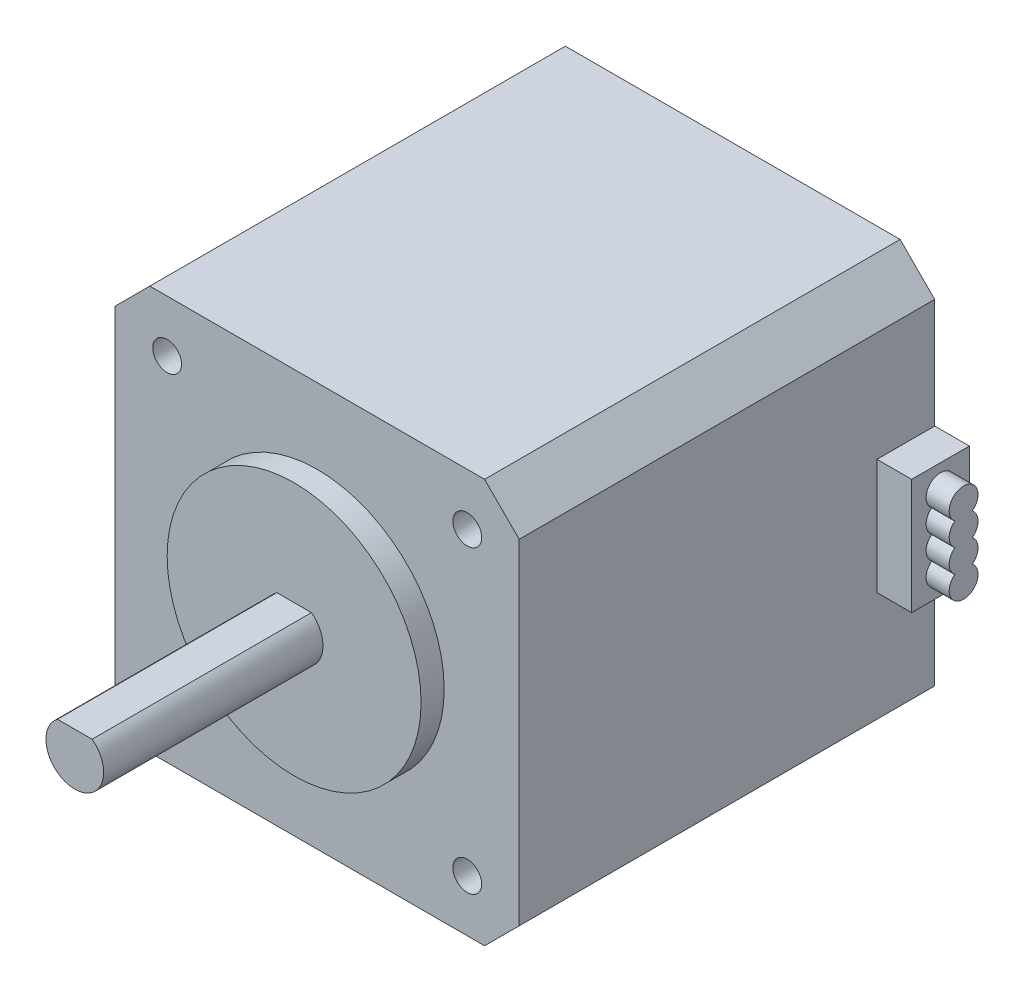
ISO-10303-21;
HEADER;
FILE_DESCRIPTION(('STEP AP214'),'2;1');
FILE_NAME('part.step','',(''),(''),'','','');
FILE_SCHEMA(('AUTOMOTIVE_DESIGN { 1 0 10303 214 1 1 1 1 }'));
ENDSEC;
DATA;
#1=APPLICATION_CONTEXT('core data for automotive mechanical design processes');
#2=APPLICATION_PROTOCOL_DEFINITION('international standard','automotive_design',2000,#1);
#3=PRODUCT_CONTEXT('',#1,'mechanical');
#4=PRODUCT('Part','Part','',(#3));
#5=PRODUCT_RELATED_PRODUCT_CATEGORY('part','',(#4));
#6=PRODUCT_DEFINITION_FORMATION('','',#4);
#7=PRODUCT_DEFINITION_CONTEXT('part definition',#1,'design');
#8=PRODUCT_DEFINITION('design','',#6,#7);
#9=PRODUCT_DEFINITION_SHAPE('','',#8);
#10=(LENGTH_UNIT() NAMED_UNIT(*) SI_UNIT(.MILLI.,.METRE.));
#11=(NAMED_UNIT(*) PLANE_ANGLE_UNIT() SI_UNIT($,.RADIAN.));
#12=(NAMED_UNIT(*) SI_UNIT($,.STERADIAN.) SOLID_ANGLE_UNIT());
#13=UNCERTAINTY_MEASURE_WITH_UNIT(LENGTH_MEASURE(1.E-05),#10,'distance_accuracy_value','');
#14=(GEOMETRIC_REPRESENTATION_CONTEXT(3) GLOBAL_UNCERTAINTY_ASSIGNED_CONTEXT((#13)) GLOBAL_UNIT_ASSIGNED_CONTEXT((#10,
#11,#12)) REPRESENTATION_CONTEXT('',''));
#15=CARTESIAN_POINT('',(0.,0.,0.));
#16=DIRECTION('',(0.,0.,1.));
#17=DIRECTION('',(1.,0.,0.));
#18=AXIS2_PLACEMENT_3D('',#15,#16,#17);
#19=CARTESIAN_POINT('',(17.5,-14.5,-36.));
#20=DIRECTION('',(1.,0.,0.));
#21=DIRECTION('',(0.,0.,-1.));
#22=AXIS2_PLACEMENT_3D('',#19,#20,#21);
#23=PLANE('',#22);
#24=DIRECTION('',(0.,1.,0.));
#25=VECTOR('',#24,1.);
#26=CARTESIAN_POINT('',(17.5,-5.,-31.));
#27=LINE('',#26,#25);
#28=CARTESIAN_POINT('',(17.5,-5.,-31.));
#29=VERTEX_POINT('',#28);
#30=CARTESIAN_POINT('',(17.5,5.,-31.));
#31=VERTEX_POINT('',#30);
#32=EDGE_CURVE('E88',#29,#31,#27,.T.);
#33=ORIENTED_EDGE('',*,*,#32,.T.);
#34=DIRECTION('',(0.,0.,-1.));
#35=VECTOR('',#34,1.);
#36=CARTESIAN_POINT('',(17.5,5.,-31.));
#37=LINE('',#36,#35);
#38=CARTESIAN_POINT('',(17.5,5.,-36.));
#39=VERTEX_POINT('',#38);
#40=EDGE_CURVE('E277',#31,#39,#37,.T.);
#41=ORIENTED_EDGE('',*,*,#40,.T.);
#42=DIRECTION('',(0.,1.,0.));
#43=VECTOR('',#42,1.);
#44=CARTESIAN_POINT('',(17.5,-14.5,-36.));
#45=LINE('',#44,#43);
#46=CARTESIAN_POINT('',(17.5,14.5,-36.));
#47=VERTEX_POINT('',#46);
#48=EDGE_CURVE('E286',#39,#47,#45,.T.);
#49=ORIENTED_EDGE('',*,*,#48,.T.);
#50=DIRECTION('',(0.,0.,1.));
#51=VECTOR('',#50,1.);
#52=CARTESIAN_POINT('',(17.5,14.5,-36.));
#53=LINE('',#52,#51);
#54=CARTESIAN_POINT('',(17.5,14.5,0.));
#55=VERTEX_POINT('',#54);
#56=EDGE_CURVE('E370',#47,#55,#53,.T.);
#57=ORIENTED_EDGE('',*,*,#56,.T.);
#58=DIRECTION('',(0.,1.,0.));
#59=VECTOR('',#58,1.);
#60=CARTESIAN_POINT('',(17.5,-14.5,0.));
#61=LINE('',#60,#59);
#62=CARTESIAN_POINT('',(17.5,-14.5,0.));
#63=VERTEX_POINT('',#62);
#64=EDGE_CURVE('E348',#63,#55,#61,.T.);
#65=ORIENTED_EDGE('',*,*,#64,.F.);
#66=DIRECTION('',(0.,0.,1.));
#67=VECTOR('',#66,1.);
#68=CARTESIAN_POINT('',(17.5,-14.5,-36.));
#69=LINE('',#68,#67);
#70=CARTESIAN_POINT('',(17.5,-14.5,-36.));
#71=VERTEX_POINT('',#70);
#72=EDGE_CURVE('E385',#71,#63,#69,.T.);
#73=ORIENTED_EDGE('',*,*,#72,.F.);
#74=CARTESIAN_POINT('',(17.5,-5.,-36.));
#75=VERTEX_POINT('',#74);
#76=EDGE_CURVE('E365',#71,#75,#45,.T.);
#77=ORIENTED_EDGE('',*,*,#76,.T.);
#78=DIRECTION('',(0.,0.,-1.));
#79=VECTOR('',#78,1.);
#80=CARTESIAN_POINT('',(17.5,-5.,-31.));
#81=LINE('',#80,#79);
#82=EDGE_CURVE('E268',#29,#75,#81,.T.);
#83=ORIENTED_EDGE('',*,*,#82,.F.);
#84=EDGE_LOOP('',(#33,#41,#49,#57,#65,#73,#77,#83));
#85=FACE_BOUND('',#84,.T.);
#86=ADVANCED_FACE('F63',(#85),#23,.T.);
#87=CARTESIAN_POINT('',(0.,0.,0.));
#88=DIRECTION('',(0.,0.,1.));
#89=DIRECTION('',(1.,0.,0.));
#90=AXIS2_PLACEMENT_3D('',#87,#88,#89);
#91=PLANE('',#90);
#92=CARTESIAN_POINT('',(13.,13.,0.));
#93=DIRECTION('',(0.,0.,1.));
#94=DIRECTION('',(1.,0.,0.));
#95=AXIS2_PLACEMENT_3D('',#92,#93,#94);
#96=CIRCLE('',#95,1.25);
#97=CARTESIAN_POINT('',(14.25,13.,0.));
#98=VERTEX_POINT('',#97);
#99=EDGE_CURVE('E313',#98,#98,#96,.T.);
#100=ORIENTED_EDGE('',*,*,#99,.F.);
#101=EDGE_LOOP('',(#100));
#102=FACE_BOUND('',#101,.T.);
#103=CARTESIAN_POINT('',(-13.,13.,0.));
#104=DIRECTION('',(0.,0.,1.));
#105=DIRECTION('',(1.,0.,0.));
#106=AXIS2_PLACEMENT_3D('',#103,#104,#105);
#107=CIRCLE('',#106,1.25);
#108=CARTESIAN_POINT('',(-11.75,13.,0.));
#109=VERTEX_POINT('',#108);
#110=EDGE_CURVE('E319',#109,#109,#107,.T.);
#111=ORIENTED_EDGE('',*,*,#110,.F.);
#112=EDGE_LOOP('',(#111));
#113=FACE_BOUND('',#112,.T.);
#114=CARTESIAN_POINT('',(-13.,-13.,0.));
#115=DIRECTION('',(0.,0.,1.));
#116=DIRECTION('',(1.,0.,0.));
#117=AXIS2_PLACEMENT_3D('',#114,#115,#116);
#118=CIRCLE('',#117,1.25);
#119=CARTESIAN_POINT('',(-11.75,-13.,0.));
#120=VERTEX_POINT('',#119);
#121=EDGE_CURVE('E325',#120,#120,#118,.T.);
#122=ORIENTED_EDGE('',*,*,#121,.F.);
#123=EDGE_LOOP('',(#122));
#124=FACE_BOUND('',#123,.T.);
#125=CARTESIAN_POINT('',(13.,-13.,0.));
#126=DIRECTION('',(0.,0.,1.));
#127=DIRECTION('',(1.,0.,0.));
#128=AXIS2_PLACEMENT_3D('',#125,#126,#127);
#129=CIRCLE('',#128,1.25);
#130=CARTESIAN_POINT('',(14.25,-13.,0.));
#131=VERTEX_POINT('',#130);
#132=EDGE_CURVE('E331',#131,#131,#129,.T.);
#133=ORIENTED_EDGE('',*,*,#132,.F.);
#134=EDGE_LOOP('',(#133));
#135=FACE_BOUND('',#134,.T.);
#136=DIRECTION('',(-0.707106781186548,0.707106781186547,0.));
#137=VECTOR('',#136,1.);
#138=CARTESIAN_POINT('',(17.5,14.5,0.));
#139=LINE('',#138,#137);
#140=CARTESIAN_POINT('',(14.5,17.5,0.));
#141=VERTEX_POINT('',#140);
#142=EDGE_CURVE('E341',#55,#141,#139,.T.);
#143=ORIENTED_EDGE('',*,*,#142,.T.);
#144=DIRECTION('',(-1.,0.,0.));
#145=VECTOR('',#144,1.);
#146=CARTESIAN_POINT('',(14.5,17.5,0.));
#147=LINE('',#146,#145);
#148=CARTESIAN_POINT('',(-14.5,17.5,0.));
#149=VERTEX_POINT('',#148);
#150=EDGE_CURVE('E401',#141,#149,#147,.T.);
#151=ORIENTED_EDGE('',*,*,#150,.T.);
#152=DIRECTION('',(-0.707106781186547,-0.707106781186548,0.));
#153=VECTOR('',#152,1.);
#154=CARTESIAN_POINT('',(-14.5,17.5,0.));
#155=LINE('',#154,#153);
#156=CARTESIAN_POINT('',(-17.5,14.5,0.));
#157=VERTEX_POINT('',#156);
#158=EDGE_CURVE('E399',#149,#157,#155,.T.);
#159=ORIENTED_EDGE('',*,*,#158,.T.);
#160=DIRECTION('',(0.,1.,0.));
#161=VECTOR('',#160,1.);
#162=CARTESIAN_POINT('',(-17.5,-14.5,0.));
#163=LINE('',#162,#161);
#164=CARTESIAN_POINT('',(-17.5,-14.5,0.));
#165=VERTEX_POINT('',#164);
#166=EDGE_CURVE('E396',#165,#157,#163,.T.);
#167=ORIENTED_EDGE('',*,*,#166,.F.);
#168=DIRECTION('',(-0.707106781186548,0.707106781186547,0.));
#169=VECTOR('',#168,1.);
#170=CARTESIAN_POINT('',(-14.5,-17.5,0.));
#171=LINE('',#170,#169);
#172=CARTESIAN_POINT('',(-14.5,-17.5,0.));
#173=VERTEX_POINT('',#172);
#174=EDGE_CURVE('E394',#173,#165,#171,.T.);
#175=ORIENTED_EDGE('',*,*,#174,.F.);
#176=DIRECTION('',(-1.,0.,0.));
#177=VECTOR('',#176,1.);
#178=CARTESIAN_POINT('',(14.5,-17.5,0.));
#179=LINE('',#178,#177);
#180=CARTESIAN_POINT('',(14.5,-17.5,0.));
#181=VERTEX_POINT('',#180);
#182=EDGE_CURVE('E392',#181,#173,#179,.T.);
#183=ORIENTED_EDGE('',*,*,#182,.F.);
#184=DIRECTION('',(-0.707106781186548,-0.707106781186547,0.));
#185=VECTOR('',#184,1.);
#186=CARTESIAN_POINT('',(17.5,-14.5,0.));
#187=LINE('',#186,#185);
#188=EDGE_CURVE('E390',#63,#181,#187,.T.);
#189=ORIENTED_EDGE('',*,*,#188,.F.);
#190=ORIENTED_EDGE('',*,*,#64,.T.);
#191=EDGE_LOOP('',(#143,#151,#159,#167,#175,#183,#189,#190));
#192=FACE_BOUND('',#191,.T.);
#193=CARTESIAN_POINT('',(0.,0.,0.));
#194=DIRECTION('',(0.,0.,1.));
#195=DIRECTION('',(1.,0.,0.));
#196=AXIS2_PLACEMENT_3D('',#193,#194,#195);
#197=CIRCLE('',#196,11.);
#198=CARTESIAN_POINT('',(11.,0.,0.));
#199=VERTEX_POINT('',#198);
#200=EDGE_CURVE('E337',#199,#199,#197,.T.);
#201=ORIENTED_EDGE('',*,*,#200,.F.);
#202=EDGE_LOOP('',(#201));
#203=FACE_BOUND('',#202,.T.);
#204=ADVANCED_FACE('F407',(#102,#113,#124,#135,#192,#203),#91,.T.);
#205=CARTESIAN_POINT('',(17.5,14.5,-36.));
#206=DIRECTION('',(0.707106781186547,0.707106781186548,0.));
#207=DIRECTION('',(-0.707106781186548,0.707106781186547,0.));
#208=AXIS2_PLACEMENT_3D('',#205,#206,#207);
#209=PLANE('',#208);
#210=ORIENTED_EDGE('',*,*,#142,.F.);
#211=ORIENTED_EDGE('',*,*,#56,.F.);
#212=DIRECTION('',(-0.707106781186548,0.707106781186547,0.));
#213=VECTOR('',#212,1.);
#214=CARTESIAN_POINT('',(17.5,14.5,-36.));
#215=LINE('',#214,#213);
#216=CARTESIAN_POINT('',(14.5,17.5,-36.));
#217=VERTEX_POINT('',#216);
#218=EDGE_CURVE('E344',#47,#217,#215,.T.);
#219=ORIENTED_EDGE('',*,*,#218,.T.);
#220=DIRECTION('',(0.,0.,1.));
#221=VECTOR('',#220,1.);
#222=CARTESIAN_POINT('',(14.5,17.5,-36.));
#223=LINE('',#222,#221);
#224=EDGE_CURVE('E366',#217,#141,#223,.T.);
#225=ORIENTED_EDGE('',*,*,#224,.T.);
#226=EDGE_LOOP('',(#210,#211,#219,#225));
#227=FACE_BOUND('',#226,.T.);
#228=ADVANCED_FACE('F65',(#227),#209,.T.);
#229=CARTESIAN_POINT('',(17.5,-14.5,-36.));
#230=DIRECTION('',(-0.707106781186547,0.707106781186548,0.));
#231=DIRECTION('',(-0.707106781186548,-0.707106781186547,0.));
#232=AXIS2_PLACEMENT_3D('',#229,#230,#231);
#233=PLANE('',#232);
#234=ORIENTED_EDGE('',*,*,#188,.T.);
#235=DIRECTION('',(0.,0.,1.));
#236=VECTOR('',#235,1.);
#237=CARTESIAN_POINT('',(14.5,-17.5,-36.));
#238=LINE('',#237,#236);
#239=CARTESIAN_POINT('',(14.5,-17.5,-36.));
#240=VERTEX_POINT('',#239);
#241=EDGE_CURVE('E382',#240,#181,#238,.T.);
#242=ORIENTED_EDGE('',*,*,#241,.F.);
#243=DIRECTION('',(-0.707106781186548,-0.707106781186547,0.));
#244=VECTOR('',#243,1.);
#245=CARTESIAN_POINT('',(17.5,-14.5,-36.));
#246=LINE('',#245,#244);
#247=EDGE_CURVE('E360',#71,#240,#246,.T.);
#248=ORIENTED_EDGE('',*,*,#247,.F.);
#249=ORIENTED_EDGE('',*,*,#72,.T.);
#250=EDGE_LOOP('',(#234,#242,#248,#249));
#251=FACE_BOUND('',#250,.T.);
#252=ADVANCED_FACE('F444',(#251),#233,.F.);
#253=CARTESIAN_POINT('',(14.5,-17.5,-36.));
#254=DIRECTION('',(0.,1.,0.));
#255=DIRECTION('',(-1.,0.,0.));
#256=AXIS2_PLACEMENT_3D('',#253,#254,#255);
#257=PLANE('',#256);
#258=ORIENTED_EDGE('',*,*,#182,.T.);
#259=DIRECTION('',(0.,0.,1.));
#260=VECTOR('',#259,1.);
#261=CARTESIAN_POINT('',(-14.5,-17.5,-36.));
#262=LINE('',#261,#260);
#263=CARTESIAN_POINT('',(-14.5,-17.5,-36.));
#264=VERTEX_POINT('',#263);
#265=EDGE_CURVE('E379',#264,#173,#262,.T.);
#266=ORIENTED_EDGE('',*,*,#265,.F.);
#267=DIRECTION('',(-1.,0.,0.));
#268=VECTOR('',#267,1.);
#269=CARTESIAN_POINT('',(14.5,-17.5,-36.));
#270=LINE('',#269,#268);
#271=EDGE_CURVE('E358',#240,#264,#270,.T.);
#272=ORIENTED_EDGE('',*,*,#271,.F.);
#273=ORIENTED_EDGE('',*,*,#241,.T.);
#274=EDGE_LOOP('',(#258,#266,#272,#273));
#275=FACE_BOUND('',#274,.T.);
#276=ADVANCED_FACE('F435',(#275),#257,.F.);
#277=CARTESIAN_POINT('',(-14.5,-17.5,-36.));
#278=DIRECTION('',(0.707106781186547,0.707106781186548,0.));
#279=DIRECTION('',(-0.707106781186548,0.707106781186547,0.));
#280=AXIS2_PLACEMENT_3D('',#277,#278,#279);
#281=PLANE('',#280);
#282=ORIENTED_EDGE('',*,*,#174,.T.);
#283=DIRECTION('',(0.,0.,1.));
#284=VECTOR('',#283,1.);
#285=CARTESIAN_POINT('',(-17.5,-14.5,-36.));
#286=LINE('',#285,#284);
#287=CARTESIAN_POINT('',(-17.5,-14.5,-36.));
#288=VERTEX_POINT('',#287);
#289=EDGE_CURVE('E376',#288,#165,#286,.T.);
#290=ORIENTED_EDGE('',*,*,#289,.F.);
#291=DIRECTION('',(-0.707106781186548,0.707106781186547,0.));
#292=VECTOR('',#291,1.);
#293=CARTESIAN_POINT('',(-14.5,-17.5,-36.));
#294=LINE('',#293,#292);
#295=EDGE_CURVE('E356',#264,#288,#294,.T.);
#296=ORIENTED_EDGE('',*,*,#295,.F.);
#297=ORIENTED_EDGE('',*,*,#265,.T.);
#298=EDGE_LOOP('',(#282,#290,#296,#297));
#299=FACE_BOUND('',#298,.T.);
#300=ADVANCED_FACE('F431',(#299),#281,.F.);
#301=CARTESIAN_POINT('',(-17.5,-14.5,-36.));
#302=DIRECTION('',(1.,0.,0.));
#303=DIRECTION('',(0.,1.,0.));
#304=AXIS2_PLACEMENT_3D('',#301,#302,#303);
#305=PLANE('',#304);
#306=ORIENTED_EDGE('',*,*,#166,.T.);
#307=DIRECTION('',(0.,0.,1.));
#308=VECTOR('',#307,1.);
#309=CARTESIAN_POINT('',(-17.5,14.5,-36.));
#310=LINE('',#309,#308);
#311=CARTESIAN_POINT('',(-17.5,14.5,-36.));
#312=VERTEX_POINT('',#311);
#313=EDGE_CURVE('E374',#312,#157,#310,.T.);
#314=ORIENTED_EDGE('',*,*,#313,.F.);
#315=DIRECTION('',(0.,1.,0.));
#316=VECTOR('',#315,1.);
#317=CARTESIAN_POINT('',(-17.5,-14.5,-36.));
#318=LINE('',#317,#316);
#319=EDGE_CURVE('E354',#288,#312,#318,.T.);
#320=ORIENTED_EDGE('',*,*,#319,.F.);
#321=ORIENTED_EDGE('',*,*,#289,.T.);
#322=EDGE_LOOP('',(#306,#314,#320,#321));
#323=FACE_BOUND('',#322,.T.);
#324=ADVANCED_FACE('F426',(#323),#305,.F.);
#325=CARTESIAN_POINT('',(-14.5,17.5,-36.));
#326=DIRECTION('',(-0.707106781186548,0.707106781186547,0.));
#327=DIRECTION('',(-0.707106781186547,-0.707106781186548,0.));
#328=AXIS2_PLACEMENT_3D('',#325,#326,#327);
#329=PLANE('',#328);
#330=ORIENTED_EDGE('',*,*,#158,.F.);
#331=DIRECTION('',(0.,0.,1.));
#332=VECTOR('',#331,1.);
#333=CARTESIAN_POINT('',(-14.5,17.5,-36.));
#334=LINE('',#333,#332);
#335=CARTESIAN_POINT('',(-14.5,17.5,-36.));
#336=VERTEX_POINT('',#335);
#337=EDGE_CURVE('E372',#336,#149,#334,.T.);
#338=ORIENTED_EDGE('',*,*,#337,.F.);
#339=DIRECTION('',(-0.707106781186547,-0.707106781186548,0.));
#340=VECTOR('',#339,1.);
#341=CARTESIAN_POINT('',(-14.5,17.5,-36.));
#342=LINE('',#341,#340);
#343=EDGE_CURVE('E351',#336,#312,#342,.T.);
#344=ORIENTED_EDGE('',*,*,#343,.T.);
#345=ORIENTED_EDGE('',*,*,#313,.T.);
#346=EDGE_LOOP('',(#330,#338,#344,#345));
#347=FACE_BOUND('',#346,.T.);
#348=ADVANCED_FACE('F420',(#347),#329,.T.);
#349=CARTESIAN_POINT('',(14.5,17.5,-36.));
#350=DIRECTION('',(0.,1.,0.));
#351=DIRECTION('',(-1.,0.,0.));
#352=AXIS2_PLACEMENT_3D('',#349,#350,#351);
#353=PLANE('',#352);
#354=ORIENTED_EDGE('',*,*,#150,.F.);
#355=ORIENTED_EDGE('',*,*,#224,.F.);
#356=DIRECTION('',(-1.,0.,0.));
#357=VECTOR('',#356,1.);
#358=CARTESIAN_POINT('',(14.5,17.5,-36.));
#359=LINE('',#358,#357);
#360=EDGE_CURVE('E347',#217,#336,#359,.T.);
#361=ORIENTED_EDGE('',*,*,#360,.T.);
#362=ORIENTED_EDGE('',*,*,#337,.T.);
#363=EDGE_LOOP('',(#354,#355,#361,#362));
#364=FACE_BOUND('',#363,.T.);
#365=ADVANCED_FACE('F416',(#364),#353,.T.);
#366=CARTESIAN_POINT('',(0.,0.,-36.));
#367=DIRECTION('',(0.,0.,1.));
#368=DIRECTION('',(1.,0.,0.));
#369=AXIS2_PLACEMENT_3D('',#366,#367,#368);
#370=PLANE('',#369);
#371=ORIENTED_EDGE('',*,*,#218,.F.);
#372=ORIENTED_EDGE('',*,*,#48,.F.);
#373=DIRECTION('',(-1.,0.,0.));
#374=VECTOR('',#373,1.);
#375=CARTESIAN_POINT('',(20.5,5.,-36.));
#376=LINE('',#375,#374);
#377=CARTESIAN_POINT('',(20.5,5.,-36.));
#378=VERTEX_POINT('',#377);
#379=EDGE_CURVE('E292',#378,#39,#376,.T.);
#380=ORIENTED_EDGE('',*,*,#379,.F.);
#381=DIRECTION('',(0.,1.,0.));
#382=VECTOR('',#381,1.);
#383=CARTESIAN_POINT('',(20.5,-5.,-36.));
#384=LINE('',#383,#382);
#385=CARTESIAN_POINT('',(20.5,-5.,-36.));
#386=VERTEX_POINT('',#385);
#387=EDGE_CURVE('E271',#386,#378,#384,.T.);
#388=ORIENTED_EDGE('',*,*,#387,.F.);
#389=DIRECTION('',(-1.,0.,0.));
#390=VECTOR('',#389,1.);
#391=CARTESIAN_POINT('',(20.5,-5.,-36.));
#392=LINE('',#391,#390);
#393=EDGE_CURVE('E289',#386,#75,#392,.T.);
#394=ORIENTED_EDGE('',*,*,#393,.T.);
#395=ORIENTED_EDGE('',*,*,#76,.F.);
#396=ORIENTED_EDGE('',*,*,#247,.T.);
#397=ORIENTED_EDGE('',*,*,#271,.T.);
#398=ORIENTED_EDGE('',*,*,#295,.T.);
#399=ORIENTED_EDGE('',*,*,#319,.T.);
#400=ORIENTED_EDGE('',*,*,#343,.F.);
#401=ORIENTED_EDGE('',*,*,#360,.F.);
#402=EDGE_LOOP('',(#371,#372,#380,#388,#394,#395,#396,#397,#398,#399,#400,#401));
#403=FACE_BOUND('',#402,.T.);
#404=ADVANCED_FACE('F441',(#403),#370,.F.);
#405=CARTESIAN_POINT('',(0.,0.,2.));
#406=DIRECTION('',(0.,0.,-1.));
#407=DIRECTION('',(-1.,0.,0.));
#408=AXIS2_PLACEMENT_3D('',#405,#406,#407);
#409=CYLINDRICAL_SURFACE('',#408,11.);
#410=CARTESIAN_POINT('',(0.,0.,2.));
#411=DIRECTION('',(0.,0.,1.));
#412=DIRECTION('',(1.,0.,0.));
#413=AXIS2_PLACEMENT_3D('',#410,#411,#412);
#414=CIRCLE('',#413,11.);
#415=CARTESIAN_POINT('',(11.,0.,2.));
#416=VERTEX_POINT('',#415);
#417=EDGE_CURVE('E338',#416,#416,#414,.T.);
#418=ORIENTED_EDGE('',*,*,#417,.F.);
#419=EDGE_LOOP('',(#418));
#420=FACE_BOUND('',#419,.T.);
#421=ORIENTED_EDGE('',*,*,#200,.T.);
#422=EDGE_LOOP('',(#421));
#423=FACE_BOUND('',#422,.T.);
#424=ADVANCED_FACE('F464',(#420,#423),#409,.T.);
#425=CARTESIAN_POINT('',(0.,0.,2.));
#426=DIRECTION('',(0.,0.,1.));
#427=DIRECTION('',(1.,0.,0.));
#428=AXIS2_PLACEMENT_3D('',#425,#426,#427);
#429=PLANE('',#428);
#430=DIRECTION('',(-1.,0.,0.));
#431=VECTOR('',#430,1.);
#432=CARTESIAN_POINT('',(0.,2.00000000000001,2.));
#433=LINE('',#432,#431);
#434=CARTESIAN_POINT('',(1.5,2.00000000000001,2.00000000000001));
#435=VERTEX_POINT('',#434);
#436=CARTESIAN_POINT('',(-1.5,2.00000000000001,2.));
#437=VERTEX_POINT('',#436);
#438=EDGE_CURVE('E12',#435,#437,#433,.T.);
#439=ORIENTED_EDGE('',*,*,#438,.F.);
#440=CARTESIAN_POINT('',(0.,0.,2.));
#441=DIRECTION('',(0.,0.,1.));
#442=DIRECTION('',(1.,0.,0.));
#443=AXIS2_PLACEMENT_3D('',#440,#441,#442);
#444=CIRCLE('',#443,2.5);
#445=EDGE_CURVE('E72',#435,#437,#444,.F.);
#446=ORIENTED_EDGE('',*,*,#445,.T.);
#447=EDGE_LOOP('',(#439,#446));
#448=FACE_BOUND('',#447,.T.);
#449=ORIENTED_EDGE('',*,*,#417,.T.);
#450=EDGE_LOOP('',(#449));
#451=FACE_BOUND('',#450,.T.);
#452=ADVANCED_FACE('F467',(#448,#451),#429,.T.);
#453=CARTESIAN_POINT('',(13.,-13.,-5.));
#454=DIRECTION('',(0.,0.,1.));
#455=DIRECTION('',(1.,0.,0.));
#456=AXIS2_PLACEMENT_3D('',#453,#454,#455);
#457=CONICAL_SURFACE('',#456,1.25,1.02974425867665);
#458=CARTESIAN_POINT('',(13.,-13.,-5.75107577378445));
#459=VERTEX_POINT('',#458);
#460=VERTEX_LOOP('',#459);
#461=FACE_BOUND('',#460,.T.);
#462=CARTESIAN_POINT('',(13.,-13.,-5.));
#463=DIRECTION('',(0.,0.,1.));
#464=DIRECTION('',(1.,0.,0.));
#465=AXIS2_PLACEMENT_3D('',#462,#463,#464);
#466=CIRCLE('',#465,1.25);
#467=CARTESIAN_POINT('',(14.25,-13.,-5.));
#468=VERTEX_POINT('',#467);
#469=EDGE_CURVE('E334',#468,#468,#466,.T.);
#470=ORIENTED_EDGE('',*,*,#469,.T.);
#471=EDGE_LOOP('',(#470));
#472=FACE_BOUND('',#471,.T.);
#473=ADVANCED_FACE('F471',(#461,#472),#457,.F.);
#474=CARTESIAN_POINT('',(13.,-13.,0.));
#475=DIRECTION('',(0.,0.,1.));
#476=DIRECTION('',(1.,0.,0.));
#477=AXIS2_PLACEMENT_3D('',#474,#475,#476);
#478=CYLINDRICAL_SURFACE('',#477,1.25);
#479=ORIENTED_EDGE('',*,*,#469,.F.);
#480=EDGE_LOOP('',(#479));
#481=FACE_BOUND('',#480,.T.);
#482=ORIENTED_EDGE('',*,*,#132,.T.);
#483=EDGE_LOOP('',(#482));
#484=FACE_BOUND('',#483,.T.);
#485=ADVANCED_FACE('F475',(#481,#484),#478,.F.);
#486=CARTESIAN_POINT('',(-13.,-13.,-5.));
#487=DIRECTION('',(0.,0.,1.));
#488=DIRECTION('',(1.,0.,0.));
#489=AXIS2_PLACEMENT_3D('',#486,#487,#488);
#490=CONICAL_SURFACE('',#489,1.25,1.02974425867665);
#491=CARTESIAN_POINT('',(-13.,-13.,-5.75107577378445));
#492=VERTEX_POINT('',#491);
#493=VERTEX_LOOP('',#492);
#494=FACE_BOUND('',#493,.T.);
#495=CARTESIAN_POINT('',(-13.,-13.,-5.));
#496=DIRECTION('',(0.,0.,1.));
#497=DIRECTION('',(1.,0.,0.));
#498=AXIS2_PLACEMENT_3D('',#495,#496,#497);
#499=CIRCLE('',#498,1.25);
#500=CARTESIAN_POINT('',(-11.75,-13.,-5.));
#501=VERTEX_POINT('',#500);
#502=EDGE_CURVE('E328',#501,#501,#499,.T.);
#503=ORIENTED_EDGE('',*,*,#502,.T.);
#504=EDGE_LOOP('',(#503));
#505=FACE_BOUND('',#504,.T.);
#506=ADVANCED_FACE('F479',(#494,#505),#490,.F.);
#507=CARTESIAN_POINT('',(-13.,-13.,0.));
#508=DIRECTION('',(0.,0.,1.));
#509=DIRECTION('',(1.,0.,0.));
#510=AXIS2_PLACEMENT_3D('',#507,#508,#509);
#511=CYLINDRICAL_SURFACE('',#510,1.25);
#512=ORIENTED_EDGE('',*,*,#502,.F.);
#513=EDGE_LOOP('',(#512));
#514=FACE_BOUND('',#513,.T.);
#515=ORIENTED_EDGE('',*,*,#121,.T.);
#516=EDGE_LOOP('',(#515));
#517=FACE_BOUND('',#516,.T.);
#518=ADVANCED_FACE('F483',(#514,#517),#511,.F.);
#519=CARTESIAN_POINT('',(-13.,13.,-5.));
#520=DIRECTION('',(0.,0.,1.));
#521=DIRECTION('',(1.,0.,0.));
#522=AXIS2_PLACEMENT_3D('',#519,#520,#521);
#523=CONICAL_SURFACE('',#522,1.25,1.02974425867665);
#524=CARTESIAN_POINT('',(-13.,13.,-5.75107577378445));
#525=VERTEX_POINT('',#524);
#526=VERTEX_LOOP('',#525);
#527=FACE_BOUND('',#526,.T.);
#528=CARTESIAN_POINT('',(-13.,13.,-5.));
#529=DIRECTION('',(0.,0.,1.));
#530=DIRECTION('',(1.,0.,0.));
#531=AXIS2_PLACEMENT_3D('',#528,#529,#530);
#532=CIRCLE('',#531,1.25);
#533=CARTESIAN_POINT('',(-11.75,13.,-5.));
#534=VERTEX_POINT('',#533);
#535=EDGE_CURVE('E322',#534,#534,#532,.T.);
#536=ORIENTED_EDGE('',*,*,#535,.T.);
#537=EDGE_LOOP('',(#536));
#538=FACE_BOUND('',#537,.T.);
#539=ADVANCED_FACE('F487',(#527,#538),#523,.F.);
#540=CARTESIAN_POINT('',(-13.,13.,0.));
#541=DIRECTION('',(0.,0.,1.));
#542=DIRECTION('',(1.,0.,0.));
#543=AXIS2_PLACEMENT_3D('',#540,#541,#542);
#544=CYLINDRICAL_SURFACE('',#543,1.25);
#545=ORIENTED_EDGE('',*,*,#535,.F.);
#546=EDGE_LOOP('',(#545));
#547=FACE_BOUND('',#546,.T.);
#548=ORIENTED_EDGE('',*,*,#110,.T.);
#549=EDGE_LOOP('',(#548));
#550=FACE_BOUND('',#549,.T.);
#551=ADVANCED_FACE('F491',(#547,#550),#544,.F.);
#552=CARTESIAN_POINT('',(13.,13.,-5.));
#553=DIRECTION('',(0.,0.,1.));
#554=DIRECTION('',(1.,0.,0.));
#555=AXIS2_PLACEMENT_3D('',#552,#553,#554);
#556=CONICAL_SURFACE('',#555,1.25,1.02974425867665);
#557=CARTESIAN_POINT('',(13.,13.,-5.75107577378445));
#558=VERTEX_POINT('',#557);
#559=VERTEX_LOOP('',#558);
#560=FACE_BOUND('',#559,.T.);
#561=CARTESIAN_POINT('',(13.,13.,-5.));
#562=DIRECTION('',(0.,0.,1.));
#563=DIRECTION('',(1.,0.,0.));
#564=AXIS2_PLACEMENT_3D('',#561,#562,#563);
#565=CIRCLE('',#564,1.25);
#566=CARTESIAN_POINT('',(14.25,13.,-5.));
#567=VERTEX_POINT('',#566);
#568=EDGE_CURVE('E316',#567,#567,#565,.T.);
#569=ORIENTED_EDGE('',*,*,#568,.T.);
#570=EDGE_LOOP('',(#569));
#571=FACE_BOUND('',#570,.T.);
#572=ADVANCED_FACE('F495',(#560,#571),#556,.F.);
#573=CARTESIAN_POINT('',(13.,13.,0.));
#574=DIRECTION('',(0.,0.,1.));
#575=DIRECTION('',(1.,0.,0.));
#576=AXIS2_PLACEMENT_3D('',#573,#574,#575);
#577=CYLINDRICAL_SURFACE('',#576,1.25);
#578=ORIENTED_EDGE('',*,*,#568,.F.);
#579=EDGE_LOOP('',(#578));
#580=FACE_BOUND('',#579,.T.);
#581=ORIENTED_EDGE('',*,*,#99,.T.);
#582=EDGE_LOOP('',(#581));
#583=FACE_BOUND('',#582,.T.);
#584=ADVANCED_FACE('F499',(#580,#583),#577,.F.);
#585=CARTESIAN_POINT('',(0.,2.00000000000001,21.));
#586=DIRECTION('',(0.,1.,0.));
#587=DIRECTION('',(-1.,0.,0.));
#588=AXIS2_PLACEMENT_3D('',#585,#586,#587);
#589=PLANE('',#588);
#590=DIRECTION('',(0.,0.,-1.));
#591=VECTOR('',#590,1.);
#592=CARTESIAN_POINT('',(1.5,2.00000000000001,21.));
#593=LINE('',#592,#591);
#594=CARTESIAN_POINT('',(1.5,2.00000000000001,21.));
#595=VERTEX_POINT('',#594);
#596=EDGE_CURVE('E308',#595,#435,#593,.T.);
#597=ORIENTED_EDGE('',*,*,#596,.T.);
#598=ORIENTED_EDGE('',*,*,#438,.T.);
#599=DIRECTION('',(0.,0.,-1.));
#600=VECTOR('',#599,1.);
#601=CARTESIAN_POINT('',(-1.5,2.00000000000001,21.));
#602=LINE('',#601,#600);
#603=CARTESIAN_POINT('',(-1.5,2.00000000000001,21.));
#604=VERTEX_POINT('',#603);
#605=EDGE_CURVE('E311',#604,#437,#602,.T.);
#606=ORIENTED_EDGE('',*,*,#605,.F.);
#607=DIRECTION('',(1.,0.,0.));
#608=VECTOR('',#607,1.);
#609=CARTESIAN_POINT('',(0.,2.00000000000001,21.));
#610=LINE('',#609,#608);
#611=EDGE_CURVE('E303',#604,#595,#610,.T.);
#612=ORIENTED_EDGE('',*,*,#611,.T.);
#613=EDGE_LOOP('',(#597,#598,#606,#612));
#614=FACE_BOUND('',#613,.T.);
#615=ADVANCED_FACE('F503',(#614),#589,.T.);
#616=CARTESIAN_POINT('',(0.,0.,21.));
#617=DIRECTION('',(0.,0.,-1.));
#618=DIRECTION('',(-1.,0.,0.));
#619=AXIS2_PLACEMENT_3D('',#616,#617,#618);
#620=CYLINDRICAL_SURFACE('',#619,2.5);
#621=ORIENTED_EDGE('',*,*,#445,.F.);
#622=ORIENTED_EDGE('',*,*,#596,.F.);
#623=CARTESIAN_POINT('',(0.,0.,21.));
#624=DIRECTION('',(0.,0.,1.));
#625=DIRECTION('',(1.,0.,0.));
#626=AXIS2_PLACEMENT_3D('',#623,#624,#625);
#627=CIRCLE('',#626,2.5);
#628=EDGE_CURVE('E306',#604,#595,#627,.T.);
#629=ORIENTED_EDGE('',*,*,#628,.F.);
#630=ORIENTED_EDGE('',*,*,#605,.T.);
#631=EDGE_LOOP('',(#621,#622,#629,#630));
#632=FACE_BOUND('',#631,.T.);
#633=ADVANCED_FACE('F507',(#632),#620,.T.);
#634=CARTESIAN_POINT('',(0.,0.,21.));
#635=DIRECTION('',(0.,0.,1.));
#636=DIRECTION('',(1.,0.,0.));
#637=AXIS2_PLACEMENT_3D('',#634,#635,#636);
#638=PLANE('',#637);
#639=ORIENTED_EDGE('',*,*,#611,.F.);
#640=ORIENTED_EDGE('',*,*,#628,.T.);
#641=EDGE_LOOP('',(#639,#640));
#642=FACE_BOUND('',#641,.T.);
#643=ADVANCED_FACE('F511',(#642),#638,.T.);
#644=CARTESIAN_POINT('',(20.5,-5.,-31.));
#645=DIRECTION('',(0.,0.,1.));
#646=DIRECTION('',(1.,0.,0.));
#647=AXIS2_PLACEMENT_3D('',#644,#645,#646);
#648=PLANE('',#647);
#649=ORIENTED_EDGE('',*,*,#32,.F.);
#650=DIRECTION('',(-1.,0.,0.));
#651=VECTOR('',#650,1.);
#652=CARTESIAN_POINT('',(20.5,-5.,-31.));
#653=LINE('',#652,#651);
#654=CARTESIAN_POINT('',(20.5,-5.,-31.));
#655=VERTEX_POINT('',#654);
#656=EDGE_CURVE('E280',#655,#29,#653,.T.);
#657=ORIENTED_EDGE('',*,*,#656,.F.);
#658=DIRECTION('',(0.,1.,0.));
#659=VECTOR('',#658,1.);
#660=CARTESIAN_POINT('',(20.5,-5.,-31.));
#661=LINE('',#660,#659);
#662=CARTESIAN_POINT('',(20.5,5.,-31.));
#663=VERTEX_POINT('',#662);
#664=EDGE_CURVE('E264',#655,#663,#661,.T.);
#665=ORIENTED_EDGE('',*,*,#664,.T.);
#666=DIRECTION('',(-1.,0.,0.));
#667=VECTOR('',#666,1.);
#668=CARTESIAN_POINT('',(20.5,5.,-31.));
#669=LINE('',#668,#667);
#670=EDGE_CURVE('E275',#663,#31,#669,.T.);
#671=ORIENTED_EDGE('',*,*,#670,.T.);
#672=EDGE_LOOP('',(#649,#657,#665,#671));
#673=FACE_BOUND('',#672,.T.);
#674=ADVANCED_FACE('F515',(#673),#648,.T.);
#675=CARTESIAN_POINT('',(20.5,-5.,-31.));
#676=DIRECTION('',(0.,1.,0.));
#677=DIRECTION('',(0.,0.,1.));
#678=AXIS2_PLACEMENT_3D('',#675,#676,#677);
#679=PLANE('',#678);
#680=ORIENTED_EDGE('',*,*,#82,.T.);
#681=ORIENTED_EDGE('',*,*,#393,.F.);
#682=DIRECTION('',(0.,0.,-1.));
#683=VECTOR('',#682,1.);
#684=CARTESIAN_POINT('',(20.5,-5.,-31.));
#685=LINE('',#684,#683);
#686=EDGE_CURVE('E273',#655,#386,#685,.T.);
#687=ORIENTED_EDGE('',*,*,#686,.F.);
#688=ORIENTED_EDGE('',*,*,#656,.T.);
#689=EDGE_LOOP('',(#680,#681,#687,#688));
#690=FACE_BOUND('',#689,.T.);
#691=ADVANCED_FACE('F519',(#690),#679,.F.);
#692=CARTESIAN_POINT('',(20.5,5.,-31.));
#693=DIRECTION('',(0.,1.,0.));
#694=DIRECTION('',(0.,0.,1.));
#695=AXIS2_PLACEMENT_3D('',#692,#693,#694);
#696=PLANE('',#695);
#697=ORIENTED_EDGE('',*,*,#40,.F.);
#698=ORIENTED_EDGE('',*,*,#670,.F.);
#699=DIRECTION('',(0.,0.,-1.));
#700=VECTOR('',#699,1.);
#701=CARTESIAN_POINT('',(20.5,5.,-31.));
#702=LINE('',#701,#700);
#703=EDGE_CURVE('E267',#663,#378,#702,.T.);
#704=ORIENTED_EDGE('',*,*,#703,.T.);
#705=ORIENTED_EDGE('',*,*,#379,.T.);
#706=EDGE_LOOP('',(#697,#698,#704,#705));
#707=FACE_BOUND('',#706,.T.);
#708=ADVANCED_FACE('F520',(#707),#696,.T.);
#709=CARTESIAN_POINT('',(20.5,0.,0.));
#710=DIRECTION('',(-1.,0.,0.));
#711=DIRECTION('',(0.,0.,1.));
#712=AXIS2_PLACEMENT_3D('',#709,#710,#711);
#713=PLANE('',#712);
#714=CARTESIAN_POINT('',(20.5,-3.,-33.5));
#715=DIRECTION('',(-1.,0.,0.));
#716=DIRECTION('',(0.,0.,1.));
#717=AXIS2_PLACEMENT_3D('',#714,#715,#716);
#718=CIRCLE('',#717,1.25);
#719=CARTESIAN_POINT('',(20.5,-2.,-34.25));
#720=VERTEX_POINT('',#719);
#721=CARTESIAN_POINT('',(20.5,-2.,-32.75));
#722=VERTEX_POINT('',#721);
#723=EDGE_CURVE('E256',#720,#722,#718,.T.);
#724=ORIENTED_EDGE('',*,*,#723,.T.);
#725=CARTESIAN_POINT('',(20.5,-1.,-33.5));
#726=DIRECTION('',(-1.,0.,0.));
#727=DIRECTION('',(0.,0.,1.));
#728=AXIS2_PLACEMENT_3D('',#725,#726,#727);
#729=CIRCLE('',#728,1.25);
#730=CARTESIAN_POINT('',(20.5,0.,-32.75));
#731=VERTEX_POINT('',#730);
#732=EDGE_CURVE('E251',#722,#731,#729,.T.);
#733=ORIENTED_EDGE('',*,*,#732,.T.);
#734=CARTESIAN_POINT('',(20.5,1.,-33.5));
#735=DIRECTION('',(-1.,0.,0.));
#736=DIRECTION('',(0.,0.,1.));
#737=AXIS2_PLACEMENT_3D('',#734,#735,#736);
#738=CIRCLE('',#737,1.25);
#739=CARTESIAN_POINT('',(20.5,2.,-32.75));
#740=VERTEX_POINT('',#739);
#741=EDGE_CURVE('E232',#731,#740,#738,.T.);
#742=ORIENTED_EDGE('',*,*,#741,.T.);
#743=CARTESIAN_POINT('',(20.5,3.,-33.5));
#744=DIRECTION('',(-1.,0.,0.));
#745=DIRECTION('',(0.,0.,1.));
#746=AXIS2_PLACEMENT_3D('',#743,#744,#745);
#747=CIRCLE('',#746,1.25);
#748=CARTESIAN_POINT('',(20.5,1.99999999999999,-34.25));
#749=VERTEX_POINT('',#748);
#750=EDGE_CURVE('E219',#740,#749,#747,.T.);
#751=ORIENTED_EDGE('',*,*,#750,.T.);
#752=CARTESIAN_POINT('',(20.5,0.,-34.25));
#753=VERTEX_POINT('',#752);
#754=EDGE_CURVE('E228',#749,#753,#738,.T.);
#755=ORIENTED_EDGE('',*,*,#754,.T.);
#756=EDGE_CURVE('E80',#753,#720,#729,.T.);
#757=ORIENTED_EDGE('',*,*,#756,.T.);
#758=EDGE_LOOP('',(#724,#733,#742,#751,#755,#757));
#759=FACE_BOUND('',#758,.T.);
#760=ORIENTED_EDGE('',*,*,#664,.F.);
#761=ORIENTED_EDGE('',*,*,#686,.T.);
#762=ORIENTED_EDGE('',*,*,#387,.T.);
#763=ORIENTED_EDGE('',*,*,#703,.F.);
#764=EDGE_LOOP('',(#760,#761,#762,#763));
#765=FACE_BOUND('',#764,.T.);
#766=ADVANCED_FACE('F236',(#759,#765),#713,.F.);
#767=CARTESIAN_POINT('',(22.5,3.,-33.5));
#768=DIRECTION('',(-1.,0.,0.));
#769=DIRECTION('',(0.,0.,1.));
#770=AXIS2_PLACEMENT_3D('',#767,#768,#769);
#771=CYLINDRICAL_SURFACE('',#770,1.25);
#772=DIRECTION('',(-1.,0.,0.));
#773=VECTOR('',#772,1.);
#774=CARTESIAN_POINT('',(21.5,2.,-32.75));
#775=LINE('',#774,#773);
#776=CARTESIAN_POINT('',(22.5,2.,-32.75));
#777=VERTEX_POINT('',#776);
#778=EDGE_CURVE('E225',#777,#740,#775,.T.);
#779=ORIENTED_EDGE('',*,*,#778,.F.);
#780=CARTESIAN_POINT('',(22.5,3.,-33.5));
#781=DIRECTION('',(-1.,0.,0.));
#782=DIRECTION('',(0.,0.,1.));
#783=AXIS2_PLACEMENT_3D('',#780,#781,#782);
#784=CIRCLE('',#783,1.25);
#785=CARTESIAN_POINT('',(22.5,1.99999999999999,-34.25));
#786=VERTEX_POINT('',#785);
#787=EDGE_CURVE('E222',#777,#786,#784,.T.);
#788=ORIENTED_EDGE('',*,*,#787,.T.);
#789=DIRECTION('',(-1.,0.,0.));
#790=VECTOR('',#789,1.);
#791=CARTESIAN_POINT('',(21.5,1.99999999999999,-34.25));
#792=LINE('',#791,#790);
#793=EDGE_CURVE('E215',#749,#786,#792,.F.);
#794=ORIENTED_EDGE('',*,*,#793,.F.);
#795=ORIENTED_EDGE('',*,*,#750,.F.);
#796=EDGE_LOOP('',(#779,#788,#794,#795));
#797=FACE_BOUND('',#796,.T.);
#798=ADVANCED_FACE('F217',(#797),#771,.T.);
#799=CARTESIAN_POINT('',(22.5,3.,-33.5));
#800=DIRECTION('',(-1.,0.,0.));
#801=DIRECTION('',(0.,0.,1.));
#802=AXIS2_PLACEMENT_3D('',#799,#800,#801);
#803=PLANE('',#802);
#804=ORIENTED_EDGE('',*,*,#787,.F.);
#805=CARTESIAN_POINT('',(22.5,1.,-33.5));
#806=DIRECTION('',(-1.,0.,0.));
#807=DIRECTION('',(0.,0.,1.));
#808=AXIS2_PLACEMENT_3D('',#805,#806,#807);
#809=CIRCLE('',#808,1.25);
#810=CARTESIAN_POINT('',(22.5,0.,-32.75));
#811=VERTEX_POINT('',#810);
#812=EDGE_CURVE('E246',#811,#777,#809,.T.);
#813=ORIENTED_EDGE('',*,*,#812,.F.);
#814=CARTESIAN_POINT('',(22.5,-1.,-33.5));
#815=DIRECTION('',(-1.,0.,0.));
#816=DIRECTION('',(0.,0.,1.));
#817=AXIS2_PLACEMENT_3D('',#814,#815,#816);
#818=CIRCLE('',#817,1.25);
#819=CARTESIAN_POINT('',(22.5,-2.,-32.75));
#820=VERTEX_POINT('',#819);
#821=EDGE_CURVE('E250',#820,#811,#818,.T.);
#822=ORIENTED_EDGE('',*,*,#821,.F.);
#823=CARTESIAN_POINT('',(22.5,-3.,-33.5));
#824=DIRECTION('',(-1.,0.,0.));
#825=DIRECTION('',(0.,0.,1.));
#826=AXIS2_PLACEMENT_3D('',#823,#824,#825);
#827=CIRCLE('',#826,1.25);
#828=CARTESIAN_POINT('',(22.5,-2.,-34.25));
#829=VERTEX_POINT('',#828);
#830=EDGE_CURVE('E253',#829,#820,#827,.T.);
#831=ORIENTED_EDGE('',*,*,#830,.F.);
#832=CARTESIAN_POINT('',(22.5,0.,-34.25));
#833=VERTEX_POINT('',#832);
#834=EDGE_CURVE('E248',#833,#829,#818,.T.);
#835=ORIENTED_EDGE('',*,*,#834,.F.);
#836=EDGE_CURVE('E245',#786,#833,#809,.T.);
#837=ORIENTED_EDGE('',*,*,#836,.F.);
#838=EDGE_LOOP('',(#804,#813,#822,#831,#835,#837));
#839=FACE_BOUND('',#838,.T.);
#840=ADVANCED_FACE('F532',(#839),#803,.F.);
#841=CARTESIAN_POINT('',(22.5,-3.,-33.5));
#842=DIRECTION('',(-1.,0.,0.));
#843=DIRECTION('',(0.,0.,1.));
#844=AXIS2_PLACEMENT_3D('',#841,#842,#843);
#845=CYLINDRICAL_SURFACE('',#844,1.25);
#846=ORIENTED_EDGE('',*,*,#830,.T.);
#847=DIRECTION('',(-1.,0.,0.));
#848=VECTOR('',#847,1.);
#849=CARTESIAN_POINT('',(21.5,-2.,-32.75));
#850=LINE('',#849,#848);
#851=EDGE_CURVE('E233',#820,#722,#850,.T.);
#852=ORIENTED_EDGE('',*,*,#851,.T.);
#853=ORIENTED_EDGE('',*,*,#723,.F.);
#854=DIRECTION('',(-1.,0.,0.));
#855=VECTOR('',#854,1.);
#856=CARTESIAN_POINT('',(21.5,-2.,-34.25));
#857=LINE('',#856,#855);
#858=EDGE_CURVE('E258',#720,#829,#857,.F.);
#859=ORIENTED_EDGE('',*,*,#858,.T.);
#860=EDGE_LOOP('',(#846,#852,#853,#859));
#861=FACE_BOUND('',#860,.T.);
#862=ADVANCED_FACE('F528',(#861),#845,.T.);
#863=CARTESIAN_POINT('',(22.5,-1.,-33.5));
#864=DIRECTION('',(-1.,0.,0.));
#865=DIRECTION('',(0.,0.,1.));
#866=AXIS2_PLACEMENT_3D('',#863,#864,#865);
#867=CYLINDRICAL_SURFACE('',#866,1.25);
#868=ORIENTED_EDGE('',*,*,#821,.T.);
#869=DIRECTION('',(-1.,0.,0.));
#870=VECTOR('',#869,1.);
#871=CARTESIAN_POINT('',(21.5,0.,-32.75));
#872=LINE('',#871,#870);
#873=EDGE_CURVE('E240',#811,#731,#872,.T.);
#874=ORIENTED_EDGE('',*,*,#873,.T.);
#875=ORIENTED_EDGE('',*,*,#732,.F.);
#876=ORIENTED_EDGE('',*,*,#851,.F.);
#877=EDGE_LOOP('',(#868,#874,#875,#876));
#878=FACE_BOUND('',#877,.T.);
#879=ADVANCED_FACE('F531',(#878),#867,.T.);
#880=ORIENTED_EDGE('',*,*,#756,.F.);
#881=DIRECTION('',(-1.,0.,0.));
#882=VECTOR('',#881,1.);
#883=CARTESIAN_POINT('',(21.5,0.,-34.25));
#884=LINE('',#883,#882);
#885=EDGE_CURVE('E230',#753,#833,#884,.F.);
#886=ORIENTED_EDGE('',*,*,#885,.T.);
#887=ORIENTED_EDGE('',*,*,#834,.T.);
#888=ORIENTED_EDGE('',*,*,#858,.F.);
#889=EDGE_LOOP('',(#880,#886,#887,#888));
#890=FACE_BOUND('',#889,.T.);
#891=ADVANCED_FACE('F534',(#890),#867,.T.);
#892=CARTESIAN_POINT('',(22.5,1.,-33.5));
#893=DIRECTION('',(-1.,0.,0.));
#894=DIRECTION('',(0.,0.,1.));
#895=AXIS2_PLACEMENT_3D('',#892,#893,#894);
#896=CYLINDRICAL_SURFACE('',#895,1.25);
#897=ORIENTED_EDGE('',*,*,#812,.T.);
#898=ORIENTED_EDGE('',*,*,#778,.T.);
#899=ORIENTED_EDGE('',*,*,#741,.F.);
#900=ORIENTED_EDGE('',*,*,#873,.F.);
#901=EDGE_LOOP('',(#897,#898,#899,#900));
#902=FACE_BOUND('',#901,.T.);
#903=ADVANCED_FACE('F537',(#902),#896,.T.);
#904=ORIENTED_EDGE('',*,*,#754,.F.);
#905=ORIENTED_EDGE('',*,*,#793,.T.);
#906=ORIENTED_EDGE('',*,*,#836,.T.);
#907=ORIENTED_EDGE('',*,*,#885,.F.);
#908=EDGE_LOOP('',(#904,#905,#906,#907));
#909=FACE_BOUND('',#908,.T.);
#910=ADVANCED_FACE('F229',(#909),#896,.T.);
#911=CLOSED_SHELL('',(#86,#204,#228,#252,#276,#300,#324,#348,#365,#404,#424,#452,#473,#485,#506,
#518,#539,#551,#572,#584,#615,#633,#643,#674,#691,#708,#766,#798,#840,#862,#879,#891,#903,#910));
#912=MANIFOLD_SOLID_BREP('B2',#911);
#913=ADVANCED_BREP_SHAPE_REPRESENTATION('',(#18,#912),#14);
#914=SHAPE_DEFINITION_REPRESENTATION(#9,#913);
ENDSEC;
END-ISO-10303-21;
